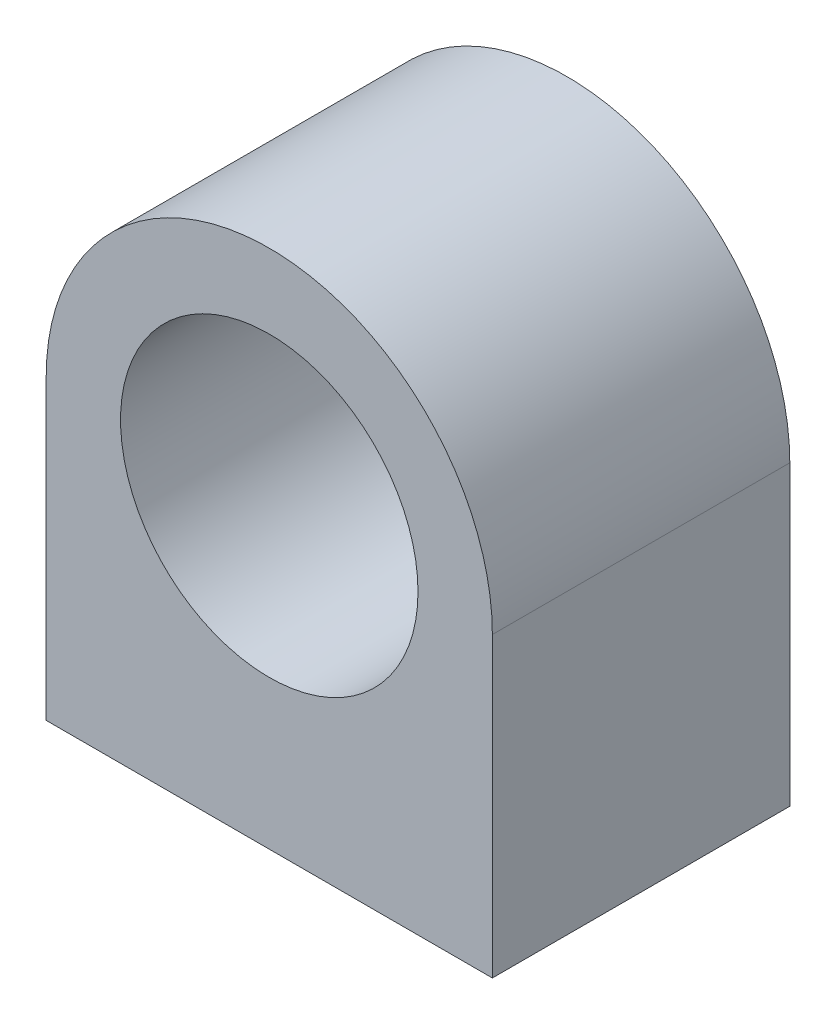
ISO-10303-21;
HEADER;
FILE_DESCRIPTION(('STEP AP214'),'2;1');
FILE_NAME('part.step','',(''),(''),'','','');
FILE_SCHEMA(('AUTOMOTIVE_DESIGN { 1 0 10303 214 1 1 1 1 }'));
ENDSEC;
DATA;
#1=APPLICATION_CONTEXT('core data for automotive mechanical design processes');
#2=APPLICATION_PROTOCOL_DEFINITION('international standard','automotive_design',2000,#1);
#3=PRODUCT_CONTEXT('',#1,'mechanical');
#4=PRODUCT('Part','Part','',(#3));
#5=PRODUCT_RELATED_PRODUCT_CATEGORY('part','',(#4));
#6=PRODUCT_DEFINITION_FORMATION('','',#4);
#7=PRODUCT_DEFINITION_CONTEXT('part definition',#1,'design');
#8=PRODUCT_DEFINITION('design','',#6,#7);
#9=PRODUCT_DEFINITION_SHAPE('','',#8);
#10=(LENGTH_UNIT() NAMED_UNIT(*) SI_UNIT(.MILLI.,.METRE.));
#11=(NAMED_UNIT(*) PLANE_ANGLE_UNIT() SI_UNIT($,.RADIAN.));
#12=(NAMED_UNIT(*) SI_UNIT($,.STERADIAN.) SOLID_ANGLE_UNIT());
#13=UNCERTAINTY_MEASURE_WITH_UNIT(LENGTH_MEASURE(1.E-05),#10,'distance_accuracy_value','');
#14=(GEOMETRIC_REPRESENTATION_CONTEXT(3) GLOBAL_UNCERTAINTY_ASSIGNED_CONTEXT((#13)) GLOBAL_UNIT_ASSIGNED_CONTEXT((#10,
#11,#12)) REPRESENTATION_CONTEXT('',''));
#15=CARTESIAN_POINT('',(0.,0.,0.));
#16=DIRECTION('',(0.,0.,1.));
#17=DIRECTION('',(1.,0.,0.));
#18=AXIS2_PLACEMENT_3D('',#15,#16,#17);
#19=CARTESIAN_POINT('',(0.,25.4,12.7));
#20=DIRECTION('',(0.,0.,1.));
#21=DIRECTION('',(1.,0.,0.));
#22=AXIS2_PLACEMENT_3D('',#19,#20,#21);
#23=PLANE('',#22);
#24=DIRECTION('',(0.,1.,0.));
#25=VECTOR('',#24,1.);
#26=CARTESIAN_POINT('',(19.05,0.,12.7));
#27=LINE('',#26,#25);
#28=CARTESIAN_POINT('',(19.05,0.,12.7));
#29=VERTEX_POINT('',#28);
#30=CARTESIAN_POINT('',(19.05,25.4,12.7));
#31=VERTEX_POINT('',#30);
#32=EDGE_CURVE('E91',#29,#31,#27,.T.);
#33=ORIENTED_EDGE('',*,*,#32,.T.);
#34=CARTESIAN_POINT('',(0.,25.4,12.7));
#35=DIRECTION('',(0.,0.,1.));
#36=DIRECTION('',(1.,0.,0.));
#37=AXIS2_PLACEMENT_3D('',#34,#35,#36);
#38=CIRCLE('',#37,19.05);
#39=CARTESIAN_POINT('',(-19.05,25.4,12.7));
#40=VERTEX_POINT('',#39);
#41=EDGE_CURVE('E86',#31,#40,#38,.T.);
#42=ORIENTED_EDGE('',*,*,#41,.T.);
#43=DIRECTION('',(0.,-1.,0.));
#44=VECTOR('',#43,1.);
#45=CARTESIAN_POINT('',(-19.05,25.4,12.7));
#46=LINE('',#45,#44);
#47=CARTESIAN_POINT('',(-19.05,0.,12.7));
#48=VERTEX_POINT('',#47);
#49=EDGE_CURVE('E87',#40,#48,#46,.T.);
#50=ORIENTED_EDGE('',*,*,#49,.T.);
#51=DIRECTION('',(1.,0.,0.));
#52=VECTOR('',#51,1.);
#53=CARTESIAN_POINT('',(-19.05,0.,12.7));
#54=LINE('',#53,#52);
#55=EDGE_CURVE('E57',#48,#29,#54,.T.);
#56=ORIENTED_EDGE('',*,*,#55,.T.);
#57=EDGE_LOOP('',(#33,#42,#50,#56));
#58=FACE_BOUND('',#57,.T.);
#59=CARTESIAN_POINT('',(0.,25.4,12.7));
#60=DIRECTION('',(0.,0.,1.));
#61=DIRECTION('',(1.,0.,0.));
#62=AXIS2_PLACEMENT_3D('',#59,#60,#61);
#63=CIRCLE('',#62,12.7);
#64=CARTESIAN_POINT('',(12.7,25.4,12.7));
#65=VERTEX_POINT('',#64);
#66=EDGE_CURVE('E108',#65,#65,#63,.T.);
#67=ORIENTED_EDGE('',*,*,#66,.F.);
#68=EDGE_LOOP('',(#67));
#69=FACE_BOUND('',#68,.T.);
#70=ADVANCED_FACE('F39',(#58,#69),#23,.T.);
#71=CARTESIAN_POINT('',(0.,25.4,-12.7));
#72=DIRECTION('',(0.,0.,1.));
#73=DIRECTION('',(1.,0.,0.));
#74=AXIS2_PLACEMENT_3D('',#71,#72,#73);
#75=PLANE('',#74);
#76=DIRECTION('',(0.,1.,0.));
#77=VECTOR('',#76,1.);
#78=CARTESIAN_POINT('',(19.05,0.,-12.7));
#79=LINE('',#78,#77);
#80=CARTESIAN_POINT('',(19.05,0.,-12.7));
#81=VERTEX_POINT('',#80);
#82=CARTESIAN_POINT('',(19.05,25.4,-12.7));
#83=VERTEX_POINT('',#82);
#84=EDGE_CURVE('E104',#81,#83,#79,.T.);
#85=ORIENTED_EDGE('',*,*,#84,.F.);
#86=DIRECTION('',(1.,0.,0.));
#87=VECTOR('',#86,1.);
#88=CARTESIAN_POINT('',(-19.05,0.,-12.7));
#89=LINE('',#88,#87);
#90=CARTESIAN_POINT('',(-19.05,0.,-12.7));
#91=VERTEX_POINT('',#90);
#92=EDGE_CURVE('E80',#91,#81,#89,.T.);
#93=ORIENTED_EDGE('',*,*,#92,.F.);
#94=DIRECTION('',(0.,-1.,0.));
#95=VECTOR('',#94,1.);
#96=CARTESIAN_POINT('',(-19.05,25.4,-12.7));
#97=LINE('',#96,#95);
#98=CARTESIAN_POINT('',(-19.05,25.4,-12.7));
#99=VERTEX_POINT('',#98);
#100=EDGE_CURVE('E71',#99,#91,#97,.T.);
#101=ORIENTED_EDGE('',*,*,#100,.F.);
#102=CARTESIAN_POINT('',(0.,25.4,-12.7));
#103=DIRECTION('',(0.,0.,1.));
#104=DIRECTION('',(1.,0.,0.));
#105=AXIS2_PLACEMENT_3D('',#102,#103,#104);
#106=CIRCLE('',#105,19.05);
#107=EDGE_CURVE('E94',#83,#99,#106,.T.);
#108=ORIENTED_EDGE('',*,*,#107,.F.);
#109=EDGE_LOOP('',(#85,#93,#101,#108));
#110=FACE_BOUND('',#109,.T.);
#111=CARTESIAN_POINT('',(0.,25.4,-12.7));
#112=DIRECTION('',(0.,0.,1.));
#113=DIRECTION('',(1.,0.,0.));
#114=AXIS2_PLACEMENT_3D('',#111,#112,#113);
#115=CIRCLE('',#114,12.7);
#116=CARTESIAN_POINT('',(12.7,25.4,-12.7));
#117=VERTEX_POINT('',#116);
#118=EDGE_CURVE('E116',#117,#117,#115,.T.);
#119=ORIENTED_EDGE('',*,*,#118,.T.);
#120=EDGE_LOOP('',(#119));
#121=FACE_BOUND('',#120,.T.);
#122=ADVANCED_FACE('F114',(#110,#121),#75,.F.);
#123=CARTESIAN_POINT('',(19.05,0.,12.7));
#124=DIRECTION('',(-1.,0.,0.));
#125=DIRECTION('',(0.,0.,1.));
#126=AXIS2_PLACEMENT_3D('',#123,#124,#125);
#127=PLANE('',#126);
#128=ORIENTED_EDGE('',*,*,#84,.T.);
#129=DIRECTION('',(0.,0.,-1.));
#130=VECTOR('',#129,1.);
#131=CARTESIAN_POINT('',(19.05,25.4,12.7));
#132=LINE('',#131,#130);
#133=EDGE_CURVE('E11',#31,#83,#132,.T.);
#134=ORIENTED_EDGE('',*,*,#133,.F.);
#135=ORIENTED_EDGE('',*,*,#32,.F.);
#136=DIRECTION('',(0.,0.,-1.));
#137=VECTOR('',#136,1.);
#138=CARTESIAN_POINT('',(19.05,0.,12.7));
#139=LINE('',#138,#137);
#140=EDGE_CURVE('E98',#29,#81,#139,.T.);
#141=ORIENTED_EDGE('',*,*,#140,.T.);
#142=EDGE_LOOP('',(#128,#134,#135,#141));
#143=FACE_BOUND('',#142,.T.);
#144=ADVANCED_FACE('F41',(#143),#127,.F.);
#145=CARTESIAN_POINT('',(0.,25.4,12.7));
#146=DIRECTION('',(0.,0.,-1.));
#147=DIRECTION('',(-1.,0.,0.));
#148=AXIS2_PLACEMENT_3D('',#145,#146,#147);
#149=CYLINDRICAL_SURFACE('',#148,19.05);
#150=ORIENTED_EDGE('',*,*,#107,.T.);
#151=DIRECTION('',(0.,0.,-1.));
#152=VECTOR('',#151,1.);
#153=CARTESIAN_POINT('',(-19.05,25.4,12.7));
#154=LINE('',#153,#152);
#155=EDGE_CURVE('E48',#40,#99,#154,.T.);
#156=ORIENTED_EDGE('',*,*,#155,.F.);
#157=ORIENTED_EDGE('',*,*,#41,.F.);
#158=ORIENTED_EDGE('',*,*,#133,.T.);
#159=EDGE_LOOP('',(#150,#156,#157,#158));
#160=FACE_BOUND('',#159,.T.);
#161=ADVANCED_FACE('F92',(#160),#149,.T.);
#162=CARTESIAN_POINT('',(-19.05,25.4,12.7));
#163=DIRECTION('',(1.,0.,0.));
#164=DIRECTION('',(0.,0.,-1.));
#165=AXIS2_PLACEMENT_3D('',#162,#163,#164);
#166=PLANE('',#165);
#167=ORIENTED_EDGE('',*,*,#100,.T.);
#168=DIRECTION('',(0.,0.,-1.));
#169=VECTOR('',#168,1.);
#170=CARTESIAN_POINT('',(-19.05,0.,12.7));
#171=LINE('',#170,#169);
#172=EDGE_CURVE('E96',#48,#91,#171,.T.);
#173=ORIENTED_EDGE('',*,*,#172,.F.);
#174=ORIENTED_EDGE('',*,*,#49,.F.);
#175=ORIENTED_EDGE('',*,*,#155,.T.);
#176=EDGE_LOOP('',(#167,#173,#174,#175));
#177=FACE_BOUND('',#176,.T.);
#178=ADVANCED_FACE('F100',(#177),#166,.F.);
#179=CARTESIAN_POINT('',(-19.05,0.,12.7));
#180=DIRECTION('',(0.,1.,0.));
#181=DIRECTION('',(0.,0.,1.));
#182=AXIS2_PLACEMENT_3D('',#179,#180,#181);
#183=PLANE('',#182);
#184=CARTESIAN_POINT('',(12.7,0.,0.));
#185=DIRECTION('',(0.,-1.,0.));
#186=DIRECTION('',(0.,0.,-1.));
#187=AXIS2_PLACEMENT_3D('',#184,#185,#186);
#188=CIRCLE('',#187,3.17500000000001);
#189=CARTESIAN_POINT('',(12.7,0.,-3.17500000000001));
#190=VERTEX_POINT('',#189);
#191=EDGE_CURVE('E135',#190,#190,#188,.T.);
#192=ORIENTED_EDGE('',*,*,#191,.F.);
#193=EDGE_LOOP('',(#192));
#194=FACE_BOUND('',#193,.T.);
#195=CARTESIAN_POINT('',(-12.7,0.,0.));
#196=DIRECTION('',(0.,-1.,0.));
#197=DIRECTION('',(0.,0.,-1.));
#198=AXIS2_PLACEMENT_3D('',#195,#196,#197);
#199=CIRCLE('',#198,3.17500000000001);
#200=CARTESIAN_POINT('',(-12.7,0.,-3.17500000000001));
#201=VERTEX_POINT('',#200);
#202=EDGE_CURVE('E128',#201,#201,#199,.T.);
#203=ORIENTED_EDGE('',*,*,#202,.F.);
#204=EDGE_LOOP('',(#203));
#205=FACE_BOUND('',#204,.T.);
#206=ORIENTED_EDGE('',*,*,#92,.T.);
#207=ORIENTED_EDGE('',*,*,#140,.F.);
#208=ORIENTED_EDGE('',*,*,#55,.F.);
#209=ORIENTED_EDGE('',*,*,#172,.T.);
#210=EDGE_LOOP('',(#206,#207,#208,#209));
#211=FACE_BOUND('',#210,.T.);
#212=ADVANCED_FACE('F112',(#194,#205,#211),#183,.F.);
#213=CARTESIAN_POINT('',(0.,25.4,12.7));
#214=DIRECTION('',(0.,0.,-1.));
#215=DIRECTION('',(-1.,0.,0.));
#216=AXIS2_PLACEMENT_3D('',#213,#214,#215);
#217=CYLINDRICAL_SURFACE('',#216,12.7);
#218=ORIENTED_EDGE('',*,*,#66,.T.);
#219=EDGE_LOOP('',(#218));
#220=FACE_BOUND('',#219,.T.);
#221=ORIENTED_EDGE('',*,*,#118,.F.);
#222=EDGE_LOOP('',(#221));
#223=FACE_BOUND('',#222,.T.);
#224=ADVANCED_FACE('F139',(#220,#223),#217,.F.);
#225=CARTESIAN_POINT('',(-12.7,12.7,0.));
#226=DIRECTION('',(0.,1.,0.));
#227=DIRECTION('',(0.,0.,1.));
#228=AXIS2_PLACEMENT_3D('',#225,#226,#227);
#229=PLANE('',#228);
#230=CARTESIAN_POINT('',(-12.7,12.7,0.));
#231=DIRECTION('',(0.,-1.,0.));
#232=DIRECTION('',(0.,0.,-1.));
#233=AXIS2_PLACEMENT_3D('',#230,#231,#232);
#234=CIRCLE('',#233,3.17500000000001);
#235=CARTESIAN_POINT('',(-12.7,12.7,-3.17500000000001));
#236=VERTEX_POINT('',#235);
#237=EDGE_CURVE('E123',#236,#236,#234,.T.);
#238=ORIENTED_EDGE('',*,*,#237,.T.);
#239=EDGE_LOOP('',(#238));
#240=FACE_BOUND('',#239,.T.);
#241=ADVANCED_FACE('F150',(#240),#229,.F.);
#242=CARTESIAN_POINT('',(-12.7,0.,0.));
#243=DIRECTION('',(0.,-1.,0.));
#244=DIRECTION('',(0.,0.,-1.));
#245=AXIS2_PLACEMENT_3D('',#242,#243,#244);
#246=CYLINDRICAL_SURFACE('',#245,3.17500000000001);
#247=ORIENTED_EDGE('',*,*,#237,.F.);
#248=EDGE_LOOP('',(#247));
#249=FACE_BOUND('',#248,.T.);
#250=ORIENTED_EDGE('',*,*,#202,.T.);
#251=EDGE_LOOP('',(#250));
#252=FACE_BOUND('',#251,.T.);
#253=ADVANCED_FACE('F143',(#249,#252),#246,.F.);
#254=CARTESIAN_POINT('',(12.7,12.7,0.));
#255=DIRECTION('',(0.,1.,0.));
#256=DIRECTION('',(0.,0.,1.));
#257=AXIS2_PLACEMENT_3D('',#254,#255,#256);
#258=PLANE('',#257);
#259=CARTESIAN_POINT('',(12.7,12.7,0.));
#260=DIRECTION('',(0.,-1.,0.));
#261=DIRECTION('',(0.,0.,-1.));
#262=AXIS2_PLACEMENT_3D('',#259,#260,#261);
#263=CIRCLE('',#262,3.17500000000001);
#264=CARTESIAN_POINT('',(12.7,12.7,-3.17500000000001));
#265=VERTEX_POINT('',#264);
#266=EDGE_CURVE('E129',#265,#265,#263,.T.);
#267=ORIENTED_EDGE('',*,*,#266,.T.);
#268=EDGE_LOOP('',(#267));
#269=FACE_BOUND('',#268,.T.);
#270=ADVANCED_FACE('F147',(#269),#258,.F.);
#271=CARTESIAN_POINT('',(12.7,0.,0.));
#272=DIRECTION('',(0.,-1.,0.));
#273=DIRECTION('',(0.,0.,-1.));
#274=AXIS2_PLACEMENT_3D('',#271,#272,#273);
#275=CYLINDRICAL_SURFACE('',#274,3.17500000000001);
#276=ORIENTED_EDGE('',*,*,#266,.F.);
#277=EDGE_LOOP('',(#276));
#278=FACE_BOUND('',#277,.T.);
#279=ORIENTED_EDGE('',*,*,#191,.T.);
#280=EDGE_LOOP('',(#279));
#281=FACE_BOUND('',#280,.T.);
#282=ADVANCED_FACE('F136',(#278,#281),#275,.F.);
#283=CLOSED_SHELL('',(#70,#122,#144,#161,#178,#212,#224,#241,#253,#270,#282));
#284=MANIFOLD_SOLID_BREP('B2',#283);
#285=ADVANCED_BREP_SHAPE_REPRESENTATION('',(#18,#284),#14);
#286=SHAPE_DEFINITION_REPRESENTATION(#9,#285);
ENDSEC;
END-ISO-10303-21;
